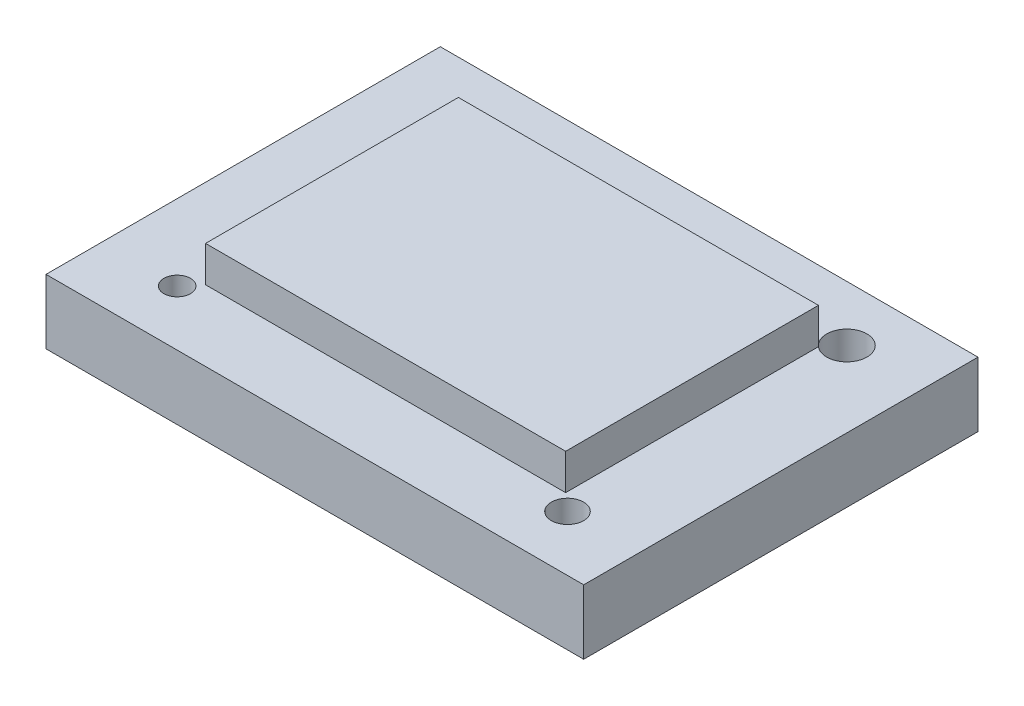
ISO-10303-21;
HEADER;
FILE_DESCRIPTION(('STEP AP214'),'2;1');
FILE_NAME('part.step','',(''),(''),'','','');
FILE_SCHEMA(('AUTOMOTIVE_DESIGN { 1 0 10303 214 1 1 1 1 }'));
ENDSEC;
DATA;
#1=APPLICATION_CONTEXT('core data for automotive mechanical design processes');
#2=APPLICATION_PROTOCOL_DEFINITION('international standard','automotive_design',2000,#1);
#3=PRODUCT_CONTEXT('',#1,'mechanical');
#4=PRODUCT('Part','Part','',(#3));
#5=PRODUCT_RELATED_PRODUCT_CATEGORY('part','',(#4));
#6=PRODUCT_DEFINITION_FORMATION('','',#4);
#7=PRODUCT_DEFINITION_CONTEXT('part definition',#1,'design');
#8=PRODUCT_DEFINITION('design','',#6,#7);
#9=PRODUCT_DEFINITION_SHAPE('','',#8);
#10=(LENGTH_UNIT() NAMED_UNIT(*) SI_UNIT(.MILLI.,.METRE.));
#11=(NAMED_UNIT(*) PLANE_ANGLE_UNIT() SI_UNIT($,.RADIAN.));
#12=(NAMED_UNIT(*) SI_UNIT($,.STERADIAN.) SOLID_ANGLE_UNIT());
#13=UNCERTAINTY_MEASURE_WITH_UNIT(LENGTH_MEASURE(1.E-05),#10,'distance_accuracy_value','');
#14=(GEOMETRIC_REPRESENTATION_CONTEXT(3) GLOBAL_UNCERTAINTY_ASSIGNED_CONTEXT((#13)) GLOBAL_UNIT_ASSIGNED_CONTEXT((#10,
#11,#12)) REPRESENTATION_CONTEXT('',''));
#15=CARTESIAN_POINT('',(0.,0.,0.));
#16=DIRECTION('',(0.,0.,1.));
#17=DIRECTION('',(1.,0.,0.));
#18=AXIS2_PLACEMENT_3D('',#15,#16,#17);
#19=CARTESIAN_POINT('',(0.,18.,0.));
#20=DIRECTION('',(0.,-1.,0.));
#21=DIRECTION('',(0.,0.,-1.));
#22=AXIS2_PLACEMENT_3D('',#19,#20,#21);
#23=PLANE('',#22);
#24=DIRECTION('',(0.,0.,-1.));
#25=VECTOR('',#24,1.);
#26=CARTESIAN_POINT('',(75.,18.,55.));
#27=LINE('',#26,#25);
#28=CARTESIAN_POINT('',(75.,18.,55.));
#29=VERTEX_POINT('',#28);
#30=CARTESIAN_POINT('',(75.,18.,-55.));
#31=VERTEX_POINT('',#30);
#32=EDGE_CURVE('E160',#29,#31,#27,.T.);
#33=ORIENTED_EDGE('',*,*,#32,.T.);
#34=DIRECTION('',(-1.,0.,0.));
#35=VECTOR('',#34,1.);
#36=CARTESIAN_POINT('',(-75.,18.,-55.));
#37=LINE('',#36,#35);
#38=CARTESIAN_POINT('',(-75.,18.,-55.));
#39=VERTEX_POINT('',#38);
#40=EDGE_CURVE('E163',#31,#39,#37,.T.);
#41=ORIENTED_EDGE('',*,*,#40,.T.);
#42=DIRECTION('',(0.,0.,1.));
#43=VECTOR('',#42,1.);
#44=CARTESIAN_POINT('',(-75.,18.,55.));
#45=LINE('',#44,#43);
#46=CARTESIAN_POINT('',(-75.,18.,55.));
#47=VERTEX_POINT('',#46);
#48=EDGE_CURVE('E166',#39,#47,#45,.T.);
#49=ORIENTED_EDGE('',*,*,#48,.T.);
#50=DIRECTION('',(1.,0.,0.));
#51=VECTOR('',#50,1.);
#52=CARTESIAN_POINT('',(-75.,18.,55.));
#53=LINE('',#52,#51);
#54=EDGE_CURVE('E168',#47,#29,#53,.T.);
#55=ORIENTED_EDGE('',*,*,#54,.T.);
#56=EDGE_LOOP('',(#33,#41,#49,#55));
#57=FACE_BOUND('',#56,.T.);
#58=CARTESIAN_POINT('',(-53.8872832369942,18.,39.5173410404624));
#59=DIRECTION('',(0.,1.,0.));
#60=DIRECTION('',(0.,0.,1.));
#61=AXIS2_PLACEMENT_3D('',#58,#59,#60);
#62=CIRCLE('',#61,3.7116049844634);
#63=CARTESIAN_POINT('',(-53.8872832369942,18.,43.2289460249258));
#64=VERTEX_POINT('',#63);
#65=EDGE_CURVE('E154',#64,#64,#62,.T.);
#66=ORIENTED_EDGE('',*,*,#65,.F.);
#67=EDGE_LOOP('',(#66));
#68=FACE_BOUND('',#67,.T.);
#69=CARTESIAN_POINT('',(55.,18.,39.5173410404624));
#70=DIRECTION('',(0.,1.,0.));
#71=DIRECTION('',(0.,0.,1.));
#72=AXIS2_PLACEMENT_3D('',#69,#70,#71);
#73=CIRCLE('',#72,4.5);
#74=CARTESIAN_POINT('',(55.,18.,44.0173410404624));
#75=VERTEX_POINT('',#74);
#76=EDGE_CURVE('E148',#75,#75,#73,.T.);
#77=ORIENTED_EDGE('',*,*,#76,.F.);
#78=EDGE_LOOP('',(#77));
#79=FACE_BOUND('',#78,.T.);
#80=CARTESIAN_POINT('',(-53.8872832369942,18.,-38.));
#81=DIRECTION('',(0.,1.,0.));
#82=DIRECTION('',(0.,0.,1.));
#83=AXIS2_PLACEMENT_3D('',#80,#81,#82);
#84=CIRCLE('',#83,1.22359139544579);
#85=CARTESIAN_POINT('',(-53.8872832369942,18.,-36.7764086045542));
#86=VERTEX_POINT('',#85);
#87=EDGE_CURVE('E142',#86,#86,#84,.T.);
#88=ORIENTED_EDGE('',*,*,#87,.F.);
#89=EDGE_LOOP('',(#88));
#90=FACE_BOUND('',#89,.T.);
#91=DIRECTION('',(0.,0.,-1.));
#92=VECTOR('',#91,1.);
#93=CARTESIAN_POINT('',(50.2262886259083,18.,0.));
#94=LINE('',#93,#92);
#95=CARTESIAN_POINT('',(50.2262886259083,18.,35.2629658901819));
#96=VERTEX_POINT('',#95);
#97=CARTESIAN_POINT('',(50.2262886259083,18.,-35.2629658901819));
#98=VERTEX_POINT('',#97);
#99=EDGE_CURVE('E124',#96,#98,#94,.T.);
#100=ORIENTED_EDGE('',*,*,#99,.F.);
#101=DIRECTION('',(1.,0.,0.));
#102=VECTOR('',#101,1.);
#103=CARTESIAN_POINT('',(0.,18.,35.2629658901819));
#104=LINE('',#103,#102);
#105=CARTESIAN_POINT('',(-50.2262886259083,18.,35.2629658901819));
#106=VERTEX_POINT('',#105);
#107=EDGE_CURVE('E59',#106,#96,#104,.T.);
#108=ORIENTED_EDGE('',*,*,#107,.F.);
#109=DIRECTION('',(0.,0.,1.));
#110=VECTOR('',#109,1.);
#111=CARTESIAN_POINT('',(-50.2262886259083,18.,0.));
#112=LINE('',#111,#110);
#113=CARTESIAN_POINT('',(-50.2262886259083,18.,-35.2629658901819));
#114=VERTEX_POINT('',#113);
#115=EDGE_CURVE('E54',#114,#106,#112,.T.);
#116=ORIENTED_EDGE('',*,*,#115,.F.);
#117=DIRECTION('',(-1.,0.,0.));
#118=VECTOR('',#117,1.);
#119=CARTESIAN_POINT('',(0.,18.,-35.2629658901819));
#120=LINE('',#119,#118);
#121=EDGE_CURVE('E125',#98,#114,#120,.T.);
#122=ORIENTED_EDGE('',*,*,#121,.F.);
#123=CARTESIAN_POINT('',(53.8872832369943,18.,-39.5173410404625));
#124=DIRECTION('',(0.,1.,0.));
#125=DIRECTION('',(0.,0.,1.));
#126=AXIS2_PLACEMENT_3D('',#123,#124,#125);
#127=CIRCLE('',#126,5.61271676300575);
#128=EDGE_CURVE('E136',#98,#98,#127,.T.);
#129=ORIENTED_EDGE('',*,*,#128,.F.);
#130=EDGE_LOOP('',(#100,#108,#116,#122,#129));
#131=FACE_BOUND('',#130,.T.);
#132=ADVANCED_FACE('F39',(#57,#68,#79,#90,#131),#23,.F.);
#133=CARTESIAN_POINT('',(0.,0.,0.));
#134=DIRECTION('',(0.,-1.,0.));
#135=DIRECTION('',(0.,0.,-1.));
#136=AXIS2_PLACEMENT_3D('',#133,#134,#135);
#137=PLANE('',#136);
#138=CARTESIAN_POINT('',(53.8872832369943,0.,-39.5173410404625));
#139=DIRECTION('',(0.,1.,0.));
#140=DIRECTION('',(0.,0.,1.));
#141=AXIS2_PLACEMENT_3D('',#138,#139,#140);
#142=CIRCLE('',#141,5.61271676300575);
#143=CARTESIAN_POINT('',(53.8872832369943,0.,-33.9046242774567));
#144=VERTEX_POINT('',#143);
#145=EDGE_CURVE('E135',#144,#144,#142,.T.);
#146=ORIENTED_EDGE('',*,*,#145,.T.);
#147=EDGE_LOOP('',(#146));
#148=FACE_BOUND('',#147,.T.);
#149=CARTESIAN_POINT('',(55.,0.,39.5173410404624));
#150=DIRECTION('',(0.,1.,0.));
#151=DIRECTION('',(0.,0.,1.));
#152=AXIS2_PLACEMENT_3D('',#149,#150,#151);
#153=CIRCLE('',#152,4.5);
#154=CARTESIAN_POINT('',(55.,0.,44.0173410404624));
#155=VERTEX_POINT('',#154);
#156=EDGE_CURVE('E145',#155,#155,#153,.T.);
#157=ORIENTED_EDGE('',*,*,#156,.T.);
#158=EDGE_LOOP('',(#157));
#159=FACE_BOUND('',#158,.T.);
#160=DIRECTION('',(0.,0.,-1.));
#161=VECTOR('',#160,1.);
#162=CARTESIAN_POINT('',(75.,0.,55.));
#163=LINE('',#162,#161);
#164=CARTESIAN_POINT('',(75.,0.,55.));
#165=VERTEX_POINT('',#164);
#166=CARTESIAN_POINT('',(75.,0.,-55.));
#167=VERTEX_POINT('',#166);
#168=EDGE_CURVE('E157',#165,#167,#163,.T.);
#169=ORIENTED_EDGE('',*,*,#168,.F.);
#170=DIRECTION('',(1.,0.,0.));
#171=VECTOR('',#170,1.);
#172=CARTESIAN_POINT('',(-75.,0.,55.));
#173=LINE('',#172,#171);
#174=CARTESIAN_POINT('',(-75.,0.,55.));
#175=VERTEX_POINT('',#174);
#176=EDGE_CURVE('E164',#175,#165,#173,.T.);
#177=ORIENTED_EDGE('',*,*,#176,.F.);
#178=DIRECTION('',(0.,0.,1.));
#179=VECTOR('',#178,1.);
#180=CARTESIAN_POINT('',(-75.,0.,55.));
#181=LINE('',#180,#179);
#182=CARTESIAN_POINT('',(-75.,0.,-55.));
#183=VERTEX_POINT('',#182);
#184=EDGE_CURVE('E175',#183,#175,#181,.T.);
#185=ORIENTED_EDGE('',*,*,#184,.F.);
#186=DIRECTION('',(-1.,0.,0.));
#187=VECTOR('',#186,1.);
#188=CARTESIAN_POINT('',(-75.,0.,-55.));
#189=LINE('',#188,#187);
#190=EDGE_CURVE('E173',#167,#183,#189,.T.);
#191=ORIENTED_EDGE('',*,*,#190,.F.);
#192=EDGE_LOOP('',(#169,#177,#185,#191));
#193=FACE_BOUND('',#192,.T.);
#194=CARTESIAN_POINT('',(-53.8872832369942,0.,39.5173410404624));
#195=DIRECTION('',(0.,1.,0.));
#196=DIRECTION('',(0.,0.,1.));
#197=AXIS2_PLACEMENT_3D('',#194,#195,#196);
#198=CIRCLE('',#197,3.7116049844634);
#199=CARTESIAN_POINT('',(-53.8872832369942,0.,43.2289460249258));
#200=VERTEX_POINT('',#199);
#201=EDGE_CURVE('E151',#200,#200,#198,.T.);
#202=ORIENTED_EDGE('',*,*,#201,.T.);
#203=EDGE_LOOP('',(#202));
#204=FACE_BOUND('',#203,.T.);
#205=CARTESIAN_POINT('',(-53.8872832369942,0.,-38.));
#206=DIRECTION('',(0.,1.,0.));
#207=DIRECTION('',(0.,0.,1.));
#208=AXIS2_PLACEMENT_3D('',#205,#206,#207);
#209=CIRCLE('',#208,1.22359139544579);
#210=CARTESIAN_POINT('',(-53.8872832369942,0.,-36.7764086045542));
#211=VERTEX_POINT('',#210);
#212=EDGE_CURVE('E139',#211,#211,#209,.T.);
#213=ORIENTED_EDGE('',*,*,#212,.T.);
#214=EDGE_LOOP('',(#213));
#215=FACE_BOUND('',#214,.T.);
#216=ADVANCED_FACE('F193',(#148,#159,#193,#204,#215),#137,.T.);
#217=CARTESIAN_POINT('',(75.,18.,55.));
#218=DIRECTION('',(-1.,0.,0.));
#219=DIRECTION('',(0.,0.,1.));
#220=AXIS2_PLACEMENT_3D('',#217,#218,#219);
#221=PLANE('',#220);
#222=ORIENTED_EDGE('',*,*,#168,.T.);
#223=DIRECTION('',(0.,-1.,0.));
#224=VECTOR('',#223,1.);
#225=CARTESIAN_POINT('',(75.,18.,-55.));
#226=LINE('',#225,#224);
#227=EDGE_CURVE('E11',#31,#167,#226,.T.);
#228=ORIENTED_EDGE('',*,*,#227,.F.);
#229=ORIENTED_EDGE('',*,*,#32,.F.);
#230=DIRECTION('',(0.,-1.,0.));
#231=VECTOR('',#230,1.);
#232=CARTESIAN_POINT('',(75.,18.,55.));
#233=LINE('',#232,#231);
#234=EDGE_CURVE('E170',#29,#165,#233,.T.);
#235=ORIENTED_EDGE('',*,*,#234,.T.);
#236=EDGE_LOOP('',(#222,#228,#229,#235));
#237=FACE_BOUND('',#236,.T.);
#238=ADVANCED_FACE('F41',(#237),#221,.F.);
#239=CARTESIAN_POINT('',(-75.,18.,-55.));
#240=DIRECTION('',(0.,0.,1.));
#241=DIRECTION('',(1.,0.,0.));
#242=AXIS2_PLACEMENT_3D('',#239,#240,#241);
#243=PLANE('',#242);
#244=ORIENTED_EDGE('',*,*,#190,.T.);
#245=DIRECTION('',(0.,-1.,0.));
#246=VECTOR('',#245,1.);
#247=CARTESIAN_POINT('',(-75.,18.,-55.));
#248=LINE('',#247,#246);
#249=EDGE_CURVE('E47',#39,#183,#248,.T.);
#250=ORIENTED_EDGE('',*,*,#249,.F.);
#251=ORIENTED_EDGE('',*,*,#40,.F.);
#252=ORIENTED_EDGE('',*,*,#227,.T.);
#253=EDGE_LOOP('',(#244,#250,#251,#252));
#254=FACE_BOUND('',#253,.T.);
#255=ADVANCED_FACE('F204',(#254),#243,.F.);
#256=CARTESIAN_POINT('',(-75.,18.,55.));
#257=DIRECTION('',(1.,0.,0.));
#258=DIRECTION('',(0.,0.,-1.));
#259=AXIS2_PLACEMENT_3D('',#256,#257,#258);
#260=PLANE('',#259);
#261=ORIENTED_EDGE('',*,*,#184,.T.);
#262=DIRECTION('',(0.,-1.,0.));
#263=VECTOR('',#262,1.);
#264=CARTESIAN_POINT('',(-75.,18.,55.));
#265=LINE('',#264,#263);
#266=EDGE_CURVE('E180',#47,#175,#265,.T.);
#267=ORIENTED_EDGE('',*,*,#266,.F.);
#268=ORIENTED_EDGE('',*,*,#48,.F.);
#269=ORIENTED_EDGE('',*,*,#249,.T.);
#270=EDGE_LOOP('',(#261,#267,#268,#269));
#271=FACE_BOUND('',#270,.T.);
#272=ADVANCED_FACE('F187',(#271),#260,.F.);
#273=CARTESIAN_POINT('',(-75.,18.,55.));
#274=DIRECTION('',(0.,0.,-1.));
#275=DIRECTION('',(-1.,0.,0.));
#276=AXIS2_PLACEMENT_3D('',#273,#274,#275);
#277=PLANE('',#276);
#278=ORIENTED_EDGE('',*,*,#176,.T.);
#279=ORIENTED_EDGE('',*,*,#234,.F.);
#280=ORIENTED_EDGE('',*,*,#54,.F.);
#281=ORIENTED_EDGE('',*,*,#266,.T.);
#282=EDGE_LOOP('',(#278,#279,#280,#281));
#283=FACE_BOUND('',#282,.T.);
#284=ADVANCED_FACE('F197',(#283),#277,.F.);
#285=CARTESIAN_POINT('',(-53.8872832369942,18.,39.5173410404624));
#286=DIRECTION('',(0.,-1.,0.));
#287=DIRECTION('',(0.,0.,-1.));
#288=AXIS2_PLACEMENT_3D('',#285,#286,#287);
#289=CYLINDRICAL_SURFACE('',#288,3.7116049844634);
#290=ORIENTED_EDGE('',*,*,#65,.T.);
#291=EDGE_LOOP('',(#290));
#292=FACE_BOUND('',#291,.T.);
#293=ORIENTED_EDGE('',*,*,#201,.F.);
#294=EDGE_LOOP('',(#293));
#295=FACE_BOUND('',#294,.T.);
#296=ADVANCED_FACE('F219',(#292,#295),#289,.F.);
#297=CARTESIAN_POINT('',(55.,18.,39.5173410404624));
#298=DIRECTION('',(0.,-1.,0.));
#299=DIRECTION('',(0.,0.,-1.));
#300=AXIS2_PLACEMENT_3D('',#297,#298,#299);
#301=CYLINDRICAL_SURFACE('',#300,4.5);
#302=ORIENTED_EDGE('',*,*,#76,.T.);
#303=EDGE_LOOP('',(#302));
#304=FACE_BOUND('',#303,.T.);
#305=ORIENTED_EDGE('',*,*,#156,.F.);
#306=EDGE_LOOP('',(#305));
#307=FACE_BOUND('',#306,.T.);
#308=ADVANCED_FACE('F226',(#304,#307),#301,.F.);
#309=CARTESIAN_POINT('',(-53.8872832369942,18.,-38.));
#310=DIRECTION('',(0.,-1.,0.));
#311=DIRECTION('',(0.,0.,-1.));
#312=AXIS2_PLACEMENT_3D('',#309,#310,#311);
#313=CYLINDRICAL_SURFACE('',#312,1.22359139544579);
#314=ORIENTED_EDGE('',*,*,#87,.T.);
#315=EDGE_LOOP('',(#314));
#316=FACE_BOUND('',#315,.T.);
#317=ORIENTED_EDGE('',*,*,#212,.F.);
#318=EDGE_LOOP('',(#317));
#319=FACE_BOUND('',#318,.T.);
#320=ADVANCED_FACE('F231',(#316,#319),#313,.F.);
#321=CARTESIAN_POINT('',(53.8872832369943,18.,-39.5173410404625));
#322=DIRECTION('',(0.,-1.,0.));
#323=DIRECTION('',(0.,0.,-1.));
#324=AXIS2_PLACEMENT_3D('',#321,#322,#323);
#325=CYLINDRICAL_SURFACE('',#324,5.61271676300575);
#326=ORIENTED_EDGE('',*,*,#145,.F.);
#327=EDGE_LOOP('',(#326));
#328=FACE_BOUND('',#327,.T.);
#329=ORIENTED_EDGE('',*,*,#128,.T.);
#330=EDGE_LOOP('',(#329));
#331=FACE_BOUND('',#330,.T.);
#332=ADVANCED_FACE('F240',(#328,#331),#325,.F.);
#333=CARTESIAN_POINT('',(-50.2262886259083,28.,35.2629658901819));
#334=DIRECTION('',(1.,0.,0.));
#335=DIRECTION('',(0.,0.,-1.));
#336=AXIS2_PLACEMENT_3D('',#333,#334,#335);
#337=PLANE('',#336);
#338=DIRECTION('',(0.,-1.,0.));
#339=VECTOR('',#338,1.);
#340=CARTESIAN_POINT('',(-50.2262886259083,28.,-35.2629658901819));
#341=LINE('',#340,#339);
#342=CARTESIAN_POINT('',(-50.2262886259083,28.,-35.2629658901819));
#343=VERTEX_POINT('',#342);
#344=EDGE_CURVE('E108',#343,#114,#341,.T.);
#345=ORIENTED_EDGE('',*,*,#344,.T.);
#346=ORIENTED_EDGE('',*,*,#115,.T.);
#347=DIRECTION('',(0.,-1.,0.));
#348=VECTOR('',#347,1.);
#349=CARTESIAN_POINT('',(-50.2262886259083,28.,35.2629658901819));
#350=LINE('',#349,#348);
#351=CARTESIAN_POINT('',(-50.2262886259083,28.,35.2629658901819));
#352=VERTEX_POINT('',#351);
#353=EDGE_CURVE('E128',#352,#106,#350,.T.);
#354=ORIENTED_EDGE('',*,*,#353,.F.);
#355=DIRECTION('',(0.,0.,1.));
#356=VECTOR('',#355,1.);
#357=CARTESIAN_POINT('',(-50.2262886259083,28.,35.2629658901819));
#358=LINE('',#357,#356);
#359=EDGE_CURVE('E111',#343,#352,#358,.T.);
#360=ORIENTED_EDGE('',*,*,#359,.F.);
#361=EDGE_LOOP('',(#345,#346,#354,#360));
#362=FACE_BOUND('',#361,.T.);
#363=ADVANCED_FACE('F246',(#362),#337,.F.);
#364=CARTESIAN_POINT('',(-50.2262886259083,28.,35.2629658901819));
#365=DIRECTION('',(0.,0.,-1.));
#366=DIRECTION('',(-1.,0.,0.));
#367=AXIS2_PLACEMENT_3D('',#364,#365,#366);
#368=PLANE('',#367);
#369=ORIENTED_EDGE('',*,*,#353,.T.);
#370=ORIENTED_EDGE('',*,*,#107,.T.);
#371=DIRECTION('',(0.,-1.,0.));
#372=VECTOR('',#371,1.);
#373=CARTESIAN_POINT('',(50.2262886259083,28.,35.2629658901819));
#374=LINE('',#373,#372);
#375=CARTESIAN_POINT('',(50.2262886259083,28.,35.2629658901819));
#376=VERTEX_POINT('',#375);
#377=EDGE_CURVE('E377',#376,#96,#374,.T.);
#378=ORIENTED_EDGE('',*,*,#377,.F.);
#379=DIRECTION('',(1.,0.,0.));
#380=VECTOR('',#379,1.);
#381=CARTESIAN_POINT('',(-50.2262886259083,28.,35.2629658901819));
#382=LINE('',#381,#380);
#383=EDGE_CURVE('E117',#352,#376,#382,.T.);
#384=ORIENTED_EDGE('',*,*,#383,.F.);
#385=EDGE_LOOP('',(#369,#370,#378,#384));
#386=FACE_BOUND('',#385,.T.);
#387=ADVANCED_FACE('F252',(#386),#368,.F.);
#388=CARTESIAN_POINT('',(50.2262886259083,28.,35.2629658901819));
#389=DIRECTION('',(-1.,0.,0.));
#390=DIRECTION('',(0.,0.,1.));
#391=AXIS2_PLACEMENT_3D('',#388,#389,#390);
#392=PLANE('',#391);
#393=ORIENTED_EDGE('',*,*,#377,.T.);
#394=ORIENTED_EDGE('',*,*,#99,.T.);
#395=DIRECTION('',(0.,-1.,0.));
#396=VECTOR('',#395,1.);
#397=CARTESIAN_POINT('',(50.2262886259083,28.,-35.2629658901819));
#398=LINE('',#397,#396);
#399=CARTESIAN_POINT('',(50.2262886259083,28.,-35.2629658901819));
#400=VERTEX_POINT('',#399);
#401=EDGE_CURVE('E106',#400,#98,#398,.T.);
#402=ORIENTED_EDGE('',*,*,#401,.F.);
#403=DIRECTION('',(0.,0.,-1.));
#404=VECTOR('',#403,1.);
#405=CARTESIAN_POINT('',(50.2262886259083,28.,35.2629658901819));
#406=LINE('',#405,#404);
#407=EDGE_CURVE('E112',#376,#400,#406,.T.);
#408=ORIENTED_EDGE('',*,*,#407,.F.);
#409=EDGE_LOOP('',(#393,#394,#402,#408));
#410=FACE_BOUND('',#409,.T.);
#411=ADVANCED_FACE('F123',(#410),#392,.F.);
#412=CARTESIAN_POINT('',(-50.2262886259083,28.,-35.2629658901819));
#413=DIRECTION('',(0.,0.,1.));
#414=DIRECTION('',(1.,0.,0.));
#415=AXIS2_PLACEMENT_3D('',#412,#413,#414);
#416=PLANE('',#415);
#417=ORIENTED_EDGE('',*,*,#401,.T.);
#418=ORIENTED_EDGE('',*,*,#121,.T.);
#419=ORIENTED_EDGE('',*,*,#344,.F.);
#420=DIRECTION('',(-1.,0.,0.));
#421=VECTOR('',#420,1.);
#422=CARTESIAN_POINT('',(-50.2262886259083,28.,-35.2629658901819));
#423=LINE('',#422,#421);
#424=EDGE_CURVE('E102',#400,#343,#423,.T.);
#425=ORIENTED_EDGE('',*,*,#424,.F.);
#426=EDGE_LOOP('',(#417,#418,#419,#425));
#427=FACE_BOUND('',#426,.T.);
#428=ADVANCED_FACE('F104',(#427),#416,.F.);
#429=CARTESIAN_POINT('',(0.,28.,0.));
#430=DIRECTION('',(0.,-1.,0.));
#431=DIRECTION('',(0.,0.,-1.));
#432=AXIS2_PLACEMENT_3D('',#429,#430,#431);
#433=PLANE('',#432);
#434=ORIENTED_EDGE('',*,*,#407,.T.);
#435=ORIENTED_EDGE('',*,*,#424,.T.);
#436=ORIENTED_EDGE('',*,*,#359,.T.);
#437=ORIENTED_EDGE('',*,*,#383,.T.);
#438=EDGE_LOOP('',(#434,#435,#436,#437));
#439=FACE_BOUND('',#438,.T.);
#440=ADVANCED_FACE('F115',(#439),#433,.F.);
#441=CLOSED_SHELL('',(#132,#216,#238,#255,#272,#284,#296,#308,#320,#332,#363,#387,#411,#428,#440));
#442=MANIFOLD_SOLID_BREP('B2',#441);
#443=ADVANCED_BREP_SHAPE_REPRESENTATION('',(#18,#442),#14);
#444=SHAPE_DEFINITION_REPRESENTATION(#9,#443);
ENDSEC;
END-ISO-10303-21;
